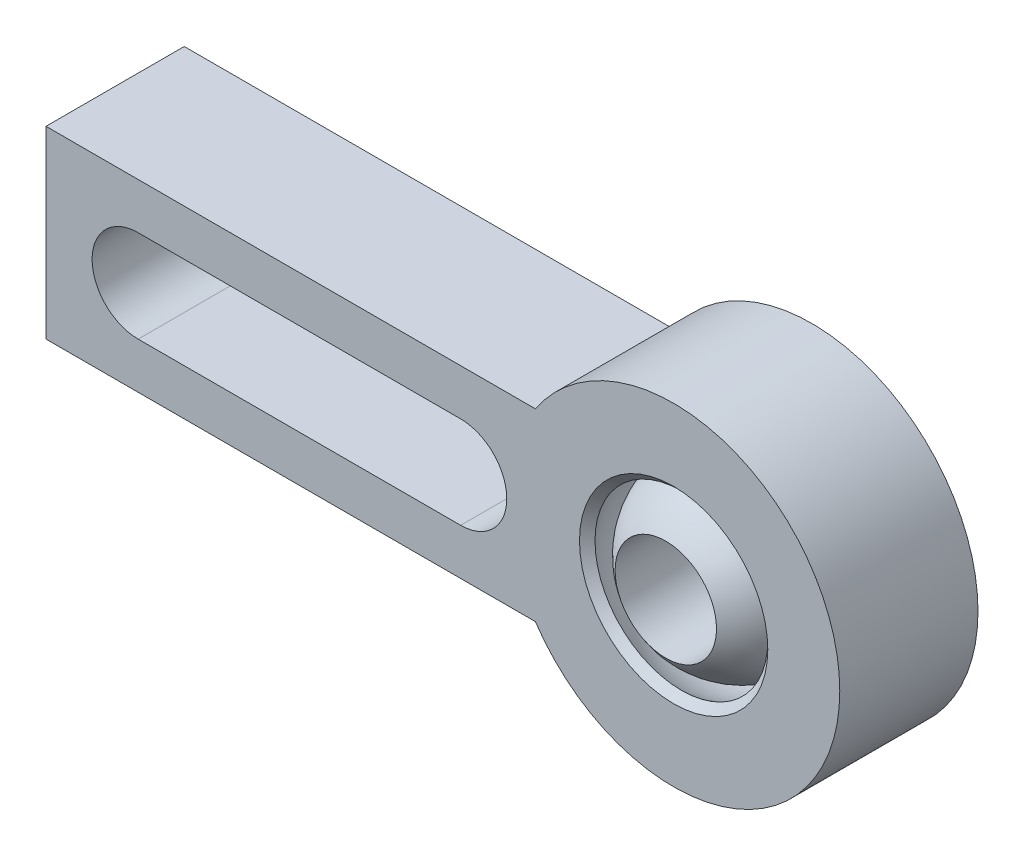
ISO-10303-21;
HEADER;
FILE_DESCRIPTION(('STEP AP214'),'2;1');
FILE_NAME('part.step','',(''),(''),'','','');
FILE_SCHEMA(('AUTOMOTIVE_DESIGN { 1 0 10303 214 1 1 1 1 }'));
ENDSEC;
DATA;
#1=APPLICATION_CONTEXT('core data for automotive mechanical design processes');
#2=APPLICATION_PROTOCOL_DEFINITION('international standard','automotive_design',2000,#1);
#3=PRODUCT_CONTEXT('',#1,'mechanical');
#4=PRODUCT('Part','Part','',(#3));
#5=PRODUCT_RELATED_PRODUCT_CATEGORY('part','',(#4));
#6=PRODUCT_DEFINITION_FORMATION('','',#4);
#7=PRODUCT_DEFINITION_CONTEXT('part definition',#1,'design');
#8=PRODUCT_DEFINITION('design','',#6,#7);
#9=PRODUCT_DEFINITION_SHAPE('','',#8);
#10=(LENGTH_UNIT() NAMED_UNIT(*) SI_UNIT(.MILLI.,.METRE.));
#11=(NAMED_UNIT(*) PLANE_ANGLE_UNIT() SI_UNIT($,.RADIAN.));
#12=(NAMED_UNIT(*) SI_UNIT($,.STERADIAN.) SOLID_ANGLE_UNIT());
#13=UNCERTAINTY_MEASURE_WITH_UNIT(LENGTH_MEASURE(1.E-05),#10,'distance_accuracy_value','');
#14=(GEOMETRIC_REPRESENTATION_CONTEXT(3) GLOBAL_UNCERTAINTY_ASSIGNED_CONTEXT((#13)) GLOBAL_UNIT_ASSIGNED_CONTEXT((#10,
#11,#12)) REPRESENTATION_CONTEXT('',''));
#15=CARTESIAN_POINT('',(0.,0.,0.));
#16=DIRECTION('',(0.,0.,1.));
#17=DIRECTION('',(1.,0.,0.));
#18=AXIS2_PLACEMENT_3D('',#15,#16,#17);
#19=CARTESIAN_POINT('',(10.0213757171376,4.61972539257759,0.));
#20=DIRECTION('',(0.,1.,0.));
#21=DIRECTION('',(1.,0.,0.));
#22=AXIS2_PLACEMENT_3D('',#19,#20,#21);
#23=SPHERICAL_SURFACE('',#22,5.08);
#24=CARTESIAN_POINT('',(10.0213757171376,4.61972539257759,0.));
#25=DIRECTION('',(0.,0.,-1.));
#26=DIRECTION('',(-1.,0.,0.));
#27=AXIS2_PLACEMENT_3D('',#24,#25,#26);
#28=SPHERICAL_SURFACE('',#27,5.08);
#29=CARTESIAN_POINT('',(10.0213757171376,4.61972539257759,4.24263644447648));
#30=DIRECTION('',(0.,0.,-1.));
#31=DIRECTION('',(-1.,0.,0.));
#32=AXIS2_PLACEMENT_3D('',#29,#30,#31);
#33=CIRCLE('',#32,2.794);
#34=CARTESIAN_POINT('',(7.22737571713757,4.61972539257759,4.24263644447648));
#35=VERTEX_POINT('',#34);
#36=EDGE_CURVE('E12',#35,#35,#33,.F.);
#37=ORIENTED_EDGE('',*,*,#36,.F.);
#38=EDGE_LOOP('',(#37));
#39=FACE_BOUND('',#38,.T.);
#40=CARTESIAN_POINT('',(10.0213757171376,4.61972539257759,-4.24263644447648));
#41=DIRECTION('',(0.,0.,1.));
#42=DIRECTION('',(1.,0.,0.));
#43=AXIS2_PLACEMENT_3D('',#40,#41,#42);
#44=CIRCLE('',#43,2.794);
#45=CARTESIAN_POINT('',(12.8153757171376,4.61972539257759,-4.24263644447648));
#46=VERTEX_POINT('',#45);
#47=EDGE_CURVE('E137',#46,#46,#44,.F.);
#48=ORIENTED_EDGE('',*,*,#47,.F.);
#49=EDGE_LOOP('',(#48));
#50=FACE_BOUND('',#49,.T.);
#51=ADVANCED_FACE('F131',(#39,#50),#28,.T.);
#52=CARTESIAN_POINT('',(10.0213757171376,4.61972539257759,-5.08));
#53=DIRECTION('',(0.,0.,1.));
#54=DIRECTION('',(1.,0.,0.));
#55=AXIS2_PLACEMENT_3D('',#52,#53,#54);
#56=CYLINDRICAL_SURFACE('',#55,2.794);
#57=ORIENTED_EDGE('',*,*,#47,.T.);
#58=EDGE_LOOP('',(#57));
#59=FACE_BOUND('',#58,.T.);
#60=ORIENTED_EDGE('',*,*,#36,.T.);
#61=EDGE_LOOP('',(#60));
#62=FACE_BOUND('',#61,.T.);
#63=ADVANCED_FACE('F143',(#59,#62),#56,.F.);
#64=CLOSED_SHELL('',(#51,#63));
#65=MANIFOLD_SOLID_BREP('B2',#64);
#66=CARTESIAN_POINT('',(0.,0.,-3.81));
#67=DIRECTION('',(0.,0.,1.));
#68=DIRECTION('',(1.,0.,0.));
#69=AXIS2_PLACEMENT_3D('',#66,#67,#68);
#70=PLANE('',#69);
#71=CARTESIAN_POINT('',(10.0213757171376,4.61972539257759,-3.81));
#72=DIRECTION('',(0.,0.,1.));
#73=DIRECTION('',(1.,0.,0.));
#74=AXIS2_PLACEMENT_3D('',#71,#72,#73);
#75=CIRCLE('',#74,4.9689736245864);
#76=CARTESIAN_POINT('',(14.990349341724,4.61972539257759,-3.81));
#77=VERTEX_POINT('',#76);
#78=EDGE_CURVE('E264',#77,#77,#75,.T.);
#79=ORIENTED_EDGE('',*,*,#78,.T.);
#80=EDGE_LOOP('',(#79));
#81=FACE_BOUND('',#80,.T.);
#82=CARTESIAN_POINT('',(-1.71864054099052,4.61972539257759,-3.81));
#83=DIRECTION('',(0.,0.,1.));
#84=DIRECTION('',(1.,0.,0.));
#85=AXIS2_PLACEMENT_3D('',#82,#83,#84);
#86=CIRCLE('',#85,2.54);
#87=CARTESIAN_POINT('',(-1.71864054099052,2.07972539257759,-3.81));
#88=VERTEX_POINT('',#87);
#89=CARTESIAN_POINT('',(-1.71864054099052,7.15972539257759,-3.81));
#90=VERTEX_POINT('',#89);
#91=EDGE_CURVE('E307',#88,#90,#86,.T.);
#92=ORIENTED_EDGE('',*,*,#91,.T.);
#93=DIRECTION('',(1.,0.,0.));
#94=VECTOR('',#93,1.);
#95=CARTESIAN_POINT('',(0.,7.15972539257759,-3.81));
#96=LINE('',#95,#94);
#97=CARTESIAN_POINT('',(-19.4986405409905,7.15972539257759,-3.81));
#98=VERTEX_POINT('',#97);
#99=EDGE_CURVE('E312',#98,#90,#96,.T.);
#100=ORIENTED_EDGE('',*,*,#99,.F.);
#101=CARTESIAN_POINT('',(-19.4986405409905,4.61972539257759,-3.81));
#102=DIRECTION('',(0.,0.,1.));
#103=DIRECTION('',(1.,0.,0.));
#104=AXIS2_PLACEMENT_3D('',#101,#102,#103);
#105=CIRCLE('',#104,2.54);
#106=CARTESIAN_POINT('',(-19.4986405409905,2.07972539257759,-3.81));
#107=VERTEX_POINT('',#106);
#108=EDGE_CURVE('E348',#98,#107,#105,.T.);
#109=ORIENTED_EDGE('',*,*,#108,.T.);
#110=DIRECTION('',(1.,0.,0.));
#111=VECTOR('',#110,1.);
#112=CARTESIAN_POINT('',(0.,2.07972539257759,-3.81));
#113=LINE('',#112,#111);
#114=EDGE_CURVE('E345',#107,#88,#113,.T.);
#115=ORIENTED_EDGE('',*,*,#114,.T.);
#116=EDGE_LOOP('',(#92,#100,#109,#115));
#117=FACE_BOUND('',#116,.T.);
#118=CARTESIAN_POINT('',(10.0213757171376,4.61972539257759,-3.81));
#119=DIRECTION('',(0.,0.,1.));
#120=DIRECTION('',(1.,0.,0.));
#121=AXIS2_PLACEMENT_3D('',#118,#119,#120);
#122=CIRCLE('',#121,9.15810023967853);
#123=CARTESIAN_POINT('',(2.40137571713757,9.69972539257759,-3.81));
#124=VERTEX_POINT('',#123);
#125=CARTESIAN_POINT('',(2.40137571713757,-0.460274607422405,-3.81));
#126=VERTEX_POINT('',#125);
#127=EDGE_CURVE('E309',#124,#126,#122,.F.);
#128=ORIENTED_EDGE('',*,*,#127,.T.);
#129=DIRECTION('',(-1.,0.,0.));
#130=VECTOR('',#129,1.);
#131=CARTESIAN_POINT('',(0.,-0.460274607422405,-3.81));
#132=LINE('',#131,#130);
#133=CARTESIAN_POINT('',(-24.5786405409905,-0.460274607422408,-3.81));
#134=VERTEX_POINT('',#133);
#135=EDGE_CURVE('E310',#126,#134,#132,.T.);
#136=ORIENTED_EDGE('',*,*,#135,.T.);
#137=DIRECTION('',(0.,-1.,0.));
#138=VECTOR('',#137,1.);
#139=CARTESIAN_POINT('',(-24.5786405409905,0.,-3.81));
#140=LINE('',#139,#138);
#141=CARTESIAN_POINT('',(-24.5786405409905,9.69972539257758,-3.81));
#142=VERTEX_POINT('',#141);
#143=EDGE_CURVE('E317',#142,#134,#140,.T.);
#144=ORIENTED_EDGE('',*,*,#143,.F.);
#145=DIRECTION('',(-1.,0.,0.));
#146=VECTOR('',#145,1.);
#147=CARTESIAN_POINT('',(0.,9.69972539257759,-3.81));
#148=LINE('',#147,#146);
#149=EDGE_CURVE('E258',#124,#142,#148,.T.);
#150=ORIENTED_EDGE('',*,*,#149,.F.);
#151=EDGE_LOOP('',(#128,#136,#144,#150));
#152=FACE_BOUND('',#151,.T.);
#153=ADVANCED_FACE('F163',(#81,#117,#152),#70,.F.);
#154=CARTESIAN_POINT('',(0.,7.15972539257759,3.81));
#155=DIRECTION('',(0.,1.,0.));
#156=DIRECTION('',(0.,0.,1.));
#157=AXIS2_PLACEMENT_3D('',#154,#155,#156);
#158=PLANE('',#157);
#159=ORIENTED_EDGE('',*,*,#99,.T.);
#160=DIRECTION('',(0.,0.,-1.));
#161=VECTOR('',#160,1.);
#162=CARTESIAN_POINT('',(-1.71864054099052,7.15972539257759,3.81));
#163=LINE('',#162,#161);
#164=CARTESIAN_POINT('',(-1.71864054099052,7.15972539257759,3.81));
#165=VERTEX_POINT('',#164);
#166=EDGE_CURVE('E269',#165,#90,#163,.T.);
#167=ORIENTED_EDGE('',*,*,#166,.F.);
#168=DIRECTION('',(1.,0.,0.));
#169=VECTOR('',#168,1.);
#170=CARTESIAN_POINT('',(0.,7.15972539257759,3.81));
#171=LINE('',#170,#169);
#172=CARTESIAN_POINT('',(-19.4986405409905,7.15972539257759,3.81));
#173=VERTEX_POINT('',#172);
#174=EDGE_CURVE('E330',#173,#165,#171,.T.);
#175=ORIENTED_EDGE('',*,*,#174,.F.);
#176=DIRECTION('',(0.,0.,-1.));
#177=VECTOR('',#176,1.);
#178=CARTESIAN_POINT('',(-19.4986405409905,7.15972539257759,3.81));
#179=LINE('',#178,#177);
#180=EDGE_CURVE('E272',#173,#98,#179,.T.);
#181=ORIENTED_EDGE('',*,*,#180,.T.);
#182=EDGE_LOOP('',(#159,#167,#175,#181));
#183=FACE_BOUND('',#182,.T.);
#184=ADVANCED_FACE('F300',(#183),#158,.F.);
#185=CARTESIAN_POINT('',(-1.71864054099052,4.61972539257759,3.81));
#186=DIRECTION('',(0.,0.,-1.));
#187=DIRECTION('',(-1.,0.,0.));
#188=AXIS2_PLACEMENT_3D('',#185,#186,#187);
#189=CYLINDRICAL_SURFACE('',#188,2.54);
#190=ORIENTED_EDGE('',*,*,#91,.F.);
#191=DIRECTION('',(0.,0.,-1.));
#192=VECTOR('',#191,1.);
#193=CARTESIAN_POINT('',(-1.71864054099052,2.07972539257759,3.81));
#194=LINE('',#193,#192);
#195=CARTESIAN_POINT('',(-1.71864054099052,2.07972539257759,3.81));
#196=VERTEX_POINT('',#195);
#197=EDGE_CURVE('E221',#196,#88,#194,.T.);
#198=ORIENTED_EDGE('',*,*,#197,.F.);
#199=CARTESIAN_POINT('',(-1.71864054099052,4.61972539257759,3.81));
#200=DIRECTION('',(0.,0.,1.));
#201=DIRECTION('',(1.,0.,0.));
#202=AXIS2_PLACEMENT_3D('',#199,#200,#201);
#203=CIRCLE('',#202,2.54);
#204=EDGE_CURVE('E316',#196,#165,#203,.T.);
#205=ORIENTED_EDGE('',*,*,#204,.T.);
#206=ORIENTED_EDGE('',*,*,#166,.T.);
#207=EDGE_LOOP('',(#190,#198,#205,#206));
#208=FACE_BOUND('',#207,.T.);
#209=ADVANCED_FACE('F302',(#208),#189,.F.);
#210=CARTESIAN_POINT('',(0.,2.07972539257759,3.81));
#211=DIRECTION('',(0.,1.,0.));
#212=DIRECTION('',(0.,0.,1.));
#213=AXIS2_PLACEMENT_3D('',#210,#211,#212);
#214=PLANE('',#213);
#215=ORIENTED_EDGE('',*,*,#114,.F.);
#216=DIRECTION('',(0.,0.,-1.));
#217=VECTOR('',#216,1.);
#218=CARTESIAN_POINT('',(-19.4986405409905,2.07972539257759,3.81));
#219=LINE('',#218,#217);
#220=CARTESIAN_POINT('',(-19.4986405409905,2.07972539257759,3.81));
#221=VERTEX_POINT('',#220);
#222=EDGE_CURVE('E275',#221,#107,#219,.T.);
#223=ORIENTED_EDGE('',*,*,#222,.F.);
#224=DIRECTION('',(1.,0.,0.));
#225=VECTOR('',#224,1.);
#226=CARTESIAN_POINT('',(0.,2.07972539257759,3.81));
#227=LINE('',#226,#225);
#228=EDGE_CURVE('E321',#221,#196,#227,.T.);
#229=ORIENTED_EDGE('',*,*,#228,.T.);
#230=ORIENTED_EDGE('',*,*,#197,.T.);
#231=EDGE_LOOP('',(#215,#223,#229,#230));
#232=FACE_BOUND('',#231,.T.);
#233=ADVANCED_FACE('F363',(#232),#214,.T.);
#234=CARTESIAN_POINT('',(-19.4986405409905,4.61972539257759,3.81));
#235=DIRECTION('',(0.,0.,-1.));
#236=DIRECTION('',(-1.,0.,0.));
#237=AXIS2_PLACEMENT_3D('',#234,#235,#236);
#238=CYLINDRICAL_SURFACE('',#237,2.54);
#239=ORIENTED_EDGE('',*,*,#108,.F.);
#240=ORIENTED_EDGE('',*,*,#180,.F.);
#241=CARTESIAN_POINT('',(-19.4986405409905,4.61972539257759,3.81));
#242=DIRECTION('',(0.,0.,1.));
#243=DIRECTION('',(1.,0.,0.));
#244=AXIS2_PLACEMENT_3D('',#241,#242,#243);
#245=CIRCLE('',#244,2.54);
#246=EDGE_CURVE('E333',#173,#221,#245,.T.);
#247=ORIENTED_EDGE('',*,*,#246,.T.);
#248=ORIENTED_EDGE('',*,*,#222,.T.);
#249=EDGE_LOOP('',(#239,#240,#247,#248));
#250=FACE_BOUND('',#249,.T.);
#251=ADVANCED_FACE('F360',(#250),#238,.F.);
#252=CARTESIAN_POINT('',(10.0213757171376,4.61972539257759,3.81));
#253=DIRECTION('',(0.,0.,-1.));
#254=DIRECTION('',(-1.,0.,0.));
#255=AXIS2_PLACEMENT_3D('',#252,#253,#254);
#256=CYLINDRICAL_SURFACE('',#255,9.15810023967853);
#257=ORIENTED_EDGE('',*,*,#127,.F.);
#258=DIRECTION('',(0.,0.,-1.));
#259=VECTOR('',#258,1.);
#260=CARTESIAN_POINT('',(2.40137571713757,9.69972539257759,3.81));
#261=LINE('',#260,#259);
#262=CARTESIAN_POINT('',(2.40137571713757,9.69972539257759,3.81));
#263=VERTEX_POINT('',#262);
#264=EDGE_CURVE('E260',#263,#124,#261,.T.);
#265=ORIENTED_EDGE('',*,*,#264,.F.);
#266=CARTESIAN_POINT('',(10.0213757171376,4.61972539257759,3.81));
#267=DIRECTION('',(0.,0.,1.));
#268=DIRECTION('',(1.,0.,0.));
#269=AXIS2_PLACEMENT_3D('',#266,#267,#268);
#270=CIRCLE('',#269,9.15810023967853);
#271=CARTESIAN_POINT('',(2.40137571713757,-0.460274607422405,3.81));
#272=VERTEX_POINT('',#271);
#273=EDGE_CURVE('E252',#263,#272,#270,.F.);
#274=ORIENTED_EDGE('',*,*,#273,.T.);
#275=DIRECTION('',(0.,0.,-1.));
#276=VECTOR('',#275,1.);
#277=CARTESIAN_POINT('',(2.40137571713757,-0.460274607422405,3.81));
#278=LINE('',#277,#276);
#279=EDGE_CURVE('E182',#272,#126,#278,.T.);
#280=ORIENTED_EDGE('',*,*,#279,.T.);
#281=EDGE_LOOP('',(#257,#265,#274,#280));
#282=FACE_BOUND('',#281,.T.);
#283=ADVANCED_FACE('F382',(#282),#256,.T.);
#284=CARTESIAN_POINT('',(0.,-0.460274607422405,3.81));
#285=DIRECTION('',(0.,-1.,0.));
#286=DIRECTION('',(1.,0.,0.));
#287=AXIS2_PLACEMENT_3D('',#284,#285,#286);
#288=PLANE('',#287);
#289=ORIENTED_EDGE('',*,*,#135,.F.);
#290=ORIENTED_EDGE('',*,*,#279,.F.);
#291=DIRECTION('',(-1.,0.,0.));
#292=VECTOR('',#291,1.);
#293=CARTESIAN_POINT('',(0.,-0.460274607422405,3.81));
#294=LINE('',#293,#292);
#295=CARTESIAN_POINT('',(-24.5786405409905,-0.460274607422408,3.81));
#296=VERTEX_POINT('',#295);
#297=EDGE_CURVE('E246',#272,#296,#294,.T.);
#298=ORIENTED_EDGE('',*,*,#297,.T.);
#299=DIRECTION('',(0.,0.,-1.));
#300=VECTOR('',#299,1.);
#301=CARTESIAN_POINT('',(-24.5786405409905,-0.460274607422408,3.81));
#302=LINE('',#301,#300);
#303=EDGE_CURVE('E209',#296,#134,#302,.T.);
#304=ORIENTED_EDGE('',*,*,#303,.T.);
#305=EDGE_LOOP('',(#289,#290,#298,#304));
#306=FACE_BOUND('',#305,.T.);
#307=ADVANCED_FACE('F314',(#306),#288,.T.);
#308=CARTESIAN_POINT('',(-24.5786405409905,0.,3.81));
#309=DIRECTION('',(1.,0.,0.));
#310=DIRECTION('',(0.,1.,0.));
#311=AXIS2_PLACEMENT_3D('',#308,#309,#310);
#312=PLANE('',#311);
#313=ORIENTED_EDGE('',*,*,#143,.T.);
#314=ORIENTED_EDGE('',*,*,#303,.F.);
#315=DIRECTION('',(0.,-1.,0.));
#316=VECTOR('',#315,1.);
#317=CARTESIAN_POINT('',(-24.5786405409905,0.,3.81));
#318=LINE('',#317,#316);
#319=CARTESIAN_POINT('',(-24.5786405409905,9.69972539257758,3.81));
#320=VERTEX_POINT('',#319);
#321=EDGE_CURVE('E237',#320,#296,#318,.T.);
#322=ORIENTED_EDGE('',*,*,#321,.F.);
#323=DIRECTION('',(0.,0.,-1.));
#324=VECTOR('',#323,1.);
#325=CARTESIAN_POINT('',(-24.5786405409905,9.69972539257758,3.81));
#326=LINE('',#325,#324);
#327=EDGE_CURVE('E241',#320,#142,#326,.T.);
#328=ORIENTED_EDGE('',*,*,#327,.T.);
#329=EDGE_LOOP('',(#313,#314,#322,#328));
#330=FACE_BOUND('',#329,.T.);
#331=ADVANCED_FACE('F239',(#330),#312,.F.);
#332=CARTESIAN_POINT('',(0.,9.69972539257759,3.81));
#333=DIRECTION('',(0.,-1.,0.));
#334=DIRECTION('',(1.,0.,0.));
#335=AXIS2_PLACEMENT_3D('',#332,#333,#334);
#336=PLANE('',#335);
#337=ORIENTED_EDGE('',*,*,#149,.T.);
#338=ORIENTED_EDGE('',*,*,#327,.F.);
#339=DIRECTION('',(-1.,0.,0.));
#340=VECTOR('',#339,1.);
#341=CARTESIAN_POINT('',(0.,9.69972539257759,3.81));
#342=LINE('',#341,#340);
#343=EDGE_CURVE('E247',#263,#320,#342,.T.);
#344=ORIENTED_EDGE('',*,*,#343,.F.);
#345=ORIENTED_EDGE('',*,*,#264,.T.);
#346=EDGE_LOOP('',(#337,#338,#344,#345));
#347=FACE_BOUND('',#346,.T.);
#348=ADVANCED_FACE('F256',(#347),#336,.F.);
#349=CARTESIAN_POINT('',(0.,0.,3.81));
#350=DIRECTION('',(0.,0.,1.));
#351=DIRECTION('',(1.,0.,0.));
#352=AXIS2_PLACEMENT_3D('',#349,#350,#351);
#353=PLANE('',#352);
#354=CARTESIAN_POINT('',(10.0213757171376,4.61972539257759,3.81));
#355=DIRECTION('',(0.,0.,1.));
#356=DIRECTION('',(1.,0.,0.));
#357=AXIS2_PLACEMENT_3D('',#354,#355,#356);
#358=CIRCLE('',#357,5.19064132663733);
#359=CARTESIAN_POINT('',(15.2120170437749,4.61972539257759,3.81));
#360=VERTEX_POINT('',#359);
#361=EDGE_CURVE('E129',#360,#360,#358,.F.);
#362=ORIENTED_EDGE('',*,*,#361,.T.);
#363=EDGE_LOOP('',(#362));
#364=FACE_BOUND('',#363,.T.);
#365=ORIENTED_EDGE('',*,*,#204,.F.);
#366=ORIENTED_EDGE('',*,*,#228,.F.);
#367=ORIENTED_EDGE('',*,*,#246,.F.);
#368=ORIENTED_EDGE('',*,*,#174,.T.);
#369=EDGE_LOOP('',(#365,#366,#367,#368));
#370=FACE_BOUND('',#369,.T.);
#371=ORIENTED_EDGE('',*,*,#273,.F.);
#372=ORIENTED_EDGE('',*,*,#343,.T.);
#373=ORIENTED_EDGE('',*,*,#321,.T.);
#374=ORIENTED_EDGE('',*,*,#297,.F.);
#375=EDGE_LOOP('',(#371,#372,#373,#374));
#376=FACE_BOUND('',#375,.T.);
#377=ADVANCED_FACE('F251',(#364,#370,#376),#353,.T.);
#378=CARTESIAN_POINT('',(10.0213757171376,4.61972539257759,0.));
#379=DIRECTION('',(0.,1.,0.));
#380=DIRECTION('',(1.,0.,0.));
#381=AXIS2_PLACEMENT_3D('',#378,#379,#380);
#382=SPHERICAL_SURFACE('',#381,5.842);
#383=CARTESIAN_POINT('',(10.0213757171376,4.61972539257759,0.));
#384=DIRECTION('',(0.,0.,1.));
#385=DIRECTION('',(1.,0.,0.));
#386=AXIS2_PLACEMENT_3D('',#383,#384,#385);
#387=SPHERICAL_SURFACE('',#386,5.842);
#388=CARTESIAN_POINT('',(10.0213757171376,4.61972539257759,-3.15082803553982));
#389=DIRECTION('',(0.,0.,1.));
#390=DIRECTION('',(1.,0.,0.));
#391=AXIS2_PLACEMENT_3D('',#388,#389,#390);
#392=CIRCLE('',#391,4.91947626180433);
#393=CARTESIAN_POINT('',(14.9408519789419,4.61972539257759,-3.15082803553982));
#394=VERTEX_POINT('',#393);
#395=EDGE_CURVE('E174',#394,#394,#392,.F.);
#396=ORIENTED_EDGE('',*,*,#395,.T.);
#397=EDGE_LOOP('',(#396));
#398=FACE_BOUND('',#397,.T.);
#399=CARTESIAN_POINT('',(10.0213757171376,4.61972539257759,3.38250874408294));
#400=DIRECTION('',(0.,0.,-1.));
#401=DIRECTION('',(-1.,0.,0.));
#402=AXIS2_PLACEMENT_3D('',#399,#400,#401);
#403=CIRCLE('',#402,4.76315007072027);
#404=CARTESIAN_POINT('',(5.2582256464173,4.61972539257759,3.38250874408294));
#405=VERTEX_POINT('',#404);
#406=EDGE_CURVE('E283',#405,#405,#403,.F.);
#407=ORIENTED_EDGE('',*,*,#406,.T.);
#408=EDGE_LOOP('',(#407));
#409=FACE_BOUND('',#408,.T.);
#410=ADVANCED_FACE('F290',(#398,#409),#387,.F.);
#411=CARTESIAN_POINT('',(10.0213757171376,4.61972539257759,-3.81));
#412=DIRECTION('',(0.,0.,-1.));
#413=DIRECTION('',(-1.,0.,0.));
#414=AXIS2_PLACEMENT_3D('',#411,#412,#413);
#415=CONICAL_SURFACE('',#414,4.9689736245864,0.0749495548442628);
#416=ORIENTED_EDGE('',*,*,#395,.F.);
#417=EDGE_LOOP('',(#416));
#418=FACE_BOUND('',#417,.T.);
#419=ORIENTED_EDGE('',*,*,#78,.F.);
#420=EDGE_LOOP('',(#419));
#421=FACE_BOUND('',#420,.T.);
#422=ADVANCED_FACE('F293',(#418,#421),#415,.F.);
#423=CARTESIAN_POINT('',(10.0213757171376,4.61972539257759,3.38250874408294));
#424=DIRECTION('',(0.,0.,1.));
#425=DIRECTION('',(1.,0.,0.));
#426=AXIS2_PLACEMENT_3D('',#423,#424,#425);
#427=CONICAL_SURFACE('',#426,4.76315007072027,0.785398163397455);
#428=ORIENTED_EDGE('',*,*,#361,.F.);
#429=EDGE_LOOP('',(#428));
#430=FACE_BOUND('',#429,.T.);
#431=ORIENTED_EDGE('',*,*,#406,.F.);
#432=EDGE_LOOP('',(#431));
#433=FACE_BOUND('',#432,.T.);
#434=ADVANCED_FACE('F166',(#430,#433),#427,.F.);
#435=CLOSED_SHELL('',(#153,#184,#209,#233,#251,#283,#307,#331,#348,#377,#410,#422,#434));
#436=MANIFOLD_SOLID_BREP('B7',#435);
#437=ADVANCED_BREP_SHAPE_REPRESENTATION('',(#18,#65,#436),#14);
#438=SHAPE_DEFINITION_REPRESENTATION(#9,#437);
ENDSEC;
END-ISO-10303-21;
